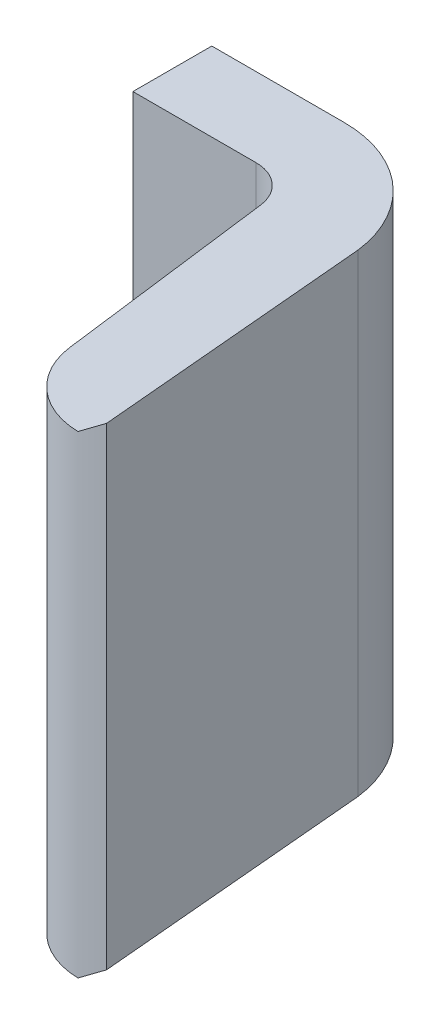
ISO-10303-21;
HEADER;
FILE_DESCRIPTION(('STEP AP214'),'2;1');
FILE_NAME('part.step','',(''),(''),'','','');
FILE_SCHEMA(('AUTOMOTIVE_DESIGN { 1 0 10303 214 1 1 1 1 }'));
ENDSEC;
DATA;
#1=APPLICATION_CONTEXT('core data for automotive mechanical design processes');
#2=APPLICATION_PROTOCOL_DEFINITION('international standard','automotive_design',2000,#1);
#3=PRODUCT_CONTEXT('',#1,'mechanical');
#4=PRODUCT('Part','Part','',(#3));
#5=PRODUCT_RELATED_PRODUCT_CATEGORY('part','',(#4));
#6=PRODUCT_DEFINITION_FORMATION('','',#4);
#7=PRODUCT_DEFINITION_CONTEXT('part definition',#1,'design');
#8=PRODUCT_DEFINITION('design','',#6,#7);
#9=PRODUCT_DEFINITION_SHAPE('','',#8);
#10=(LENGTH_UNIT() NAMED_UNIT(*) SI_UNIT(.MILLI.,.METRE.));
#11=(NAMED_UNIT(*) PLANE_ANGLE_UNIT() SI_UNIT($,.RADIAN.));
#12=(NAMED_UNIT(*) SI_UNIT($,.STERADIAN.) SOLID_ANGLE_UNIT());
#13=UNCERTAINTY_MEASURE_WITH_UNIT(LENGTH_MEASURE(1.E-05),#10,'distance_accuracy_value','');
#14=(GEOMETRIC_REPRESENTATION_CONTEXT(3) GLOBAL_UNCERTAINTY_ASSIGNED_CONTEXT((#13)) GLOBAL_UNIT_ASSIGNED_CONTEXT((#10,
#11,#12)) REPRESENTATION_CONTEXT('',''));
#15=CARTESIAN_POINT('',(0.,0.,0.));
#16=DIRECTION('',(0.,0.,1.));
#17=DIRECTION('',(1.,0.,0.));
#18=AXIS2_PLACEMENT_3D('',#15,#16,#17);
#19=CARTESIAN_POINT('',(-1.65,-0.3,0.0999999999999998));
#20=DIRECTION('',(-1.,0.,0.));
#21=DIRECTION('',(0.,0.,1.));
#22=AXIS2_PLACEMENT_3D('',#19,#20,#21);
#23=PLANE('',#22);
#24=DIRECTION('',(0.,0.,1.));
#25=VECTOR('',#24,1.);
#26=CARTESIAN_POINT('',(-1.65,-0.3,0.15));
#27=LINE('',#26,#25);
#28=CARTESIAN_POINT('',(-1.65,-0.3,0.));
#29=VERTEX_POINT('',#28);
#30=CARTESIAN_POINT('',(-1.65,-0.3,0.0999999999999998));
#31=VERTEX_POINT('',#30);
#32=EDGE_CURVE('E87',#29,#31,#27,.T.);
#33=ORIENTED_EDGE('',*,*,#32,.T.);
#34=DIRECTION('',(0.,1.,0.));
#35=VECTOR('',#34,1.);
#36=CARTESIAN_POINT('',(-1.65,-0.3,0.0999999999999998));
#37=LINE('',#36,#35);
#38=CARTESIAN_POINT('',(-1.65,0.3,0.0999999999999998));
#39=VERTEX_POINT('',#38);
#40=EDGE_CURVE('E78',#39,#31,#37,.F.);
#41=ORIENTED_EDGE('',*,*,#40,.F.);
#42=DIRECTION('',(0.,0.,1.));
#43=VECTOR('',#42,1.);
#44=CARTESIAN_POINT('',(-1.65,0.3,0.15));
#45=LINE('',#44,#43);
#46=CARTESIAN_POINT('',(-1.65,0.3,0.));
#47=VERTEX_POINT('',#46);
#48=EDGE_CURVE('E89',#47,#39,#45,.T.);
#49=ORIENTED_EDGE('',*,*,#48,.F.);
#50=DIRECTION('',(0.,1.,0.));
#51=VECTOR('',#50,1.);
#52=CARTESIAN_POINT('',(-1.65,-0.3,0.));
#53=LINE('',#52,#51);
#54=EDGE_CURVE('E84',#29,#47,#53,.T.);
#55=ORIENTED_EDGE('',*,*,#54,.F.);
#56=EDGE_LOOP('',(#33,#41,#49,#55));
#57=FACE_BOUND('',#56,.T.);
#58=ADVANCED_FACE('F16',(#57),#23,.T.);
#59=CARTESIAN_POINT('',(-1.6,-0.3,0.0999999999999998));
#60=DIRECTION('',(0.,0.,1.));
#61=DIRECTION('',(1.,0.,0.));
#62=AXIS2_PLACEMENT_3D('',#59,#60,#61);
#63=PLANE('',#62);
#64=DIRECTION('',(1.,0.,0.));
#65=VECTOR('',#64,1.);
#66=CARTESIAN_POINT('',(-1.48213745767196,-0.3,0.0999999999999998));
#67=LINE('',#66,#65);
#68=CARTESIAN_POINT('',(-1.49402710895191,-0.3,0.0999999999999999));
#69=VERTEX_POINT('',#68);
#70=EDGE_CURVE('E105',#31,#69,#67,.T.);
#71=ORIENTED_EDGE('',*,*,#70,.T.);
#72=DIRECTION('',(0.,-1.,0.));
#73=VECTOR('',#72,1.);
#74=CARTESIAN_POINT('',(-1.49402710895191,-0.3,0.1));
#75=LINE('',#74,#73);
#76=CARTESIAN_POINT('',(-1.49402710895191,0.3,0.0999999999999999));
#77=VERTEX_POINT('',#76);
#78=EDGE_CURVE('E68',#69,#77,#75,.F.);
#79=ORIENTED_EDGE('',*,*,#78,.T.);
#80=DIRECTION('',(1.,0.,0.));
#81=VECTOR('',#80,1.);
#82=CARTESIAN_POINT('',(-1.48213745767196,0.3,0.0999999999999998));
#83=LINE('',#82,#81);
#84=EDGE_CURVE('E131',#39,#77,#83,.T.);
#85=ORIENTED_EDGE('',*,*,#84,.F.);
#86=ORIENTED_EDGE('',*,*,#40,.T.);
#87=EDGE_LOOP('',(#71,#79,#85,#86));
#88=FACE_BOUND('',#87,.T.);
#89=ADVANCED_FACE('F194',(#88),#63,.T.);
#90=CARTESIAN_POINT('',(-1.49402710895191,-0.3,0.15));
#91=DIRECTION('',(0.,-1.,0.));
#92=DIRECTION('',(0.,0.,-1.));
#93=AXIS2_PLACEMENT_3D('',#90,#91,#92);
#94=CYLINDRICAL_SURFACE('',#93,0.05);
#95=ORIENTED_EDGE('',*,*,#78,.F.);
#96=CARTESIAN_POINT('',(-1.49402710895191,-0.3,0.15));
#97=DIRECTION('',(0.,-1.,0.));
#98=DIRECTION('',(0.,0.,-1.));
#99=AXIS2_PLACEMENT_3D('',#96,#97,#98);
#100=CIRCLE('',#99,0.05);
#101=CARTESIAN_POINT('',(-1.44442900532684,-0.3,0.143673222242183));
#102=VERTEX_POINT('',#101);
#103=EDGE_CURVE('E108',#69,#102,#100,.T.);
#104=ORIENTED_EDGE('',*,*,#103,.T.);
#105=DIRECTION('',(0.,1.,0.));
#106=VECTOR('',#105,1.);
#107=CARTESIAN_POINT('',(-1.44442900532684,-0.3,0.143673222242183));
#108=LINE('',#107,#106);
#109=CARTESIAN_POINT('',(-1.44442900532684,0.3,0.143673222242183));
#110=VERTEX_POINT('',#109);
#111=EDGE_CURVE('E123',#110,#102,#108,.F.);
#112=ORIENTED_EDGE('',*,*,#111,.F.);
#113=CARTESIAN_POINT('',(-1.49402710895191,0.3,0.15));
#114=DIRECTION('',(0.,-1.,0.));
#115=DIRECTION('',(0.,0.,-1.));
#116=AXIS2_PLACEMENT_3D('',#113,#114,#115);
#117=CIRCLE('',#116,0.05);
#118=EDGE_CURVE('E19',#77,#110,#117,.T.);
#119=ORIENTED_EDGE('',*,*,#118,.F.);
#120=EDGE_LOOP('',(#95,#104,#112,#119));
#121=FACE_BOUND('',#120,.T.);
#122=ADVANCED_FACE('F196',(#121),#94,.F.);
#123=CARTESIAN_POINT('',(-1.40909283035833,-0.3,0.420687420446988));
#124=DIRECTION('',(-0.991962072501402,0.,0.126535555156341));
#125=DIRECTION('',(0.126535555156341,0.,0.991962072501402));
#126=AXIS2_PLACEMENT_3D('',#123,#124,#125);
#127=PLANE('',#126);
#128=DIRECTION('',(0.126535555156347,0.,0.991962072501401));
#129=VECTOR('',#128,1.);
#130=CARTESIAN_POINT('',(-1.44442900532684,-0.3,0.143673222242183));
#131=LINE('',#130,#129);
#132=CARTESIAN_POINT('',(-1.40909283035833,-0.3,0.420687420446988));
#133=VERTEX_POINT('',#132);
#134=EDGE_CURVE('E145',#102,#133,#131,.T.);
#135=ORIENTED_EDGE('',*,*,#134,.T.);
#136=DIRECTION('',(0.,-1.,0.));
#137=VECTOR('',#136,1.);
#138=CARTESIAN_POINT('',(-1.40909283035833,-0.3,0.420687420446988));
#139=LINE('',#138,#137);
#140=CARTESIAN_POINT('',(-1.40909283035833,0.3,0.420687420446988));
#141=VERTEX_POINT('',#140);
#142=EDGE_CURVE('E118',#141,#133,#139,.T.);
#143=ORIENTED_EDGE('',*,*,#142,.F.);
#144=DIRECTION('',(0.126535555156347,0.,0.991962072501401));
#145=VECTOR('',#144,1.);
#146=CARTESIAN_POINT('',(-1.44442900532684,0.3,0.143673222242183));
#147=LINE('',#146,#145);
#148=EDGE_CURVE('E150',#110,#141,#147,.T.);
#149=ORIENTED_EDGE('',*,*,#148,.F.);
#150=ORIENTED_EDGE('',*,*,#111,.T.);
#151=EDGE_LOOP('',(#135,#143,#149,#150));
#152=FACE_BOUND('',#151,.T.);
#153=ADVANCED_FACE('F188',(#152),#127,.T.);
#154=CARTESIAN_POINT('',(-1.30989662310819,-0.3,0.408033864931354));
#155=DIRECTION('',(0.,-1.,0.));
#156=DIRECTION('',(0.,0.,-1.));
#157=AXIS2_PLACEMENT_3D('',#154,#155,#156);
#158=CYLINDRICAL_SURFACE('',#157,0.1);
#159=CARTESIAN_POINT('',(-1.30989662310819,-0.3,0.408033864931354));
#160=DIRECTION('',(0.,-1.,0.));
#161=DIRECTION('',(0.,0.,-1.));
#162=AXIS2_PLACEMENT_3D('',#159,#160,#161);
#163=CIRCLE('',#162,0.1);
#164=CARTESIAN_POINT('',(-1.30241584311224,-0.3,0.4810644546597));
#165=VERTEX_POINT('',#164);
#166=EDGE_CURVE('E100',#133,#165,#163,.F.);
#167=ORIENTED_EDGE('',*,*,#166,.T.);
#168=DIRECTION('',(0.,1.,0.));
#169=VECTOR('',#168,1.);
#170=CARTESIAN_POINT('',(-1.32208355744871,-0.3,0.507288480095486));
#171=LINE('',#170,#169);
#172=CARTESIAN_POINT('',(-1.30241584311224,0.3,0.4810644546597));
#173=VERTEX_POINT('',#172);
#174=EDGE_CURVE('E92',#173,#165,#171,.F.);
#175=ORIENTED_EDGE('',*,*,#174,.F.);
#176=CARTESIAN_POINT('',(-1.30989662310819,0.3,0.408033864931354));
#177=DIRECTION('',(0.,-1.,0.));
#178=DIRECTION('',(0.,0.,-1.));
#179=AXIS2_PLACEMENT_3D('',#176,#177,#178);
#180=CIRCLE('',#179,0.1);
#181=EDGE_CURVE('E110',#141,#173,#180,.F.);
#182=ORIENTED_EDGE('',*,*,#181,.F.);
#183=ORIENTED_EDGE('',*,*,#142,.T.);
#184=EDGE_LOOP('',(#167,#175,#182,#183));
#185=FACE_BOUND('',#184,.T.);
#186=ADVANCED_FACE('F190',(#185),#158,.T.);
#187=CARTESIAN_POINT('',(-1.3,-0.3,0.51));
#188=DIRECTION('',(-0.12186934340515,0.,0.992546151641322));
#189=DIRECTION('',(0.992546151641322,0.,0.12186934340515));
#190=AXIS2_PLACEMENT_3D('',#187,#188,#189);
#191=PLANE('',#190);
#192=ORIENTED_EDGE('',*,*,#174,.T.);
#193=DIRECTION('',(0.,-1.,0.));
#194=VECTOR('',#193,1.);
#195=CARTESIAN_POINT('',(-1.28492710388734,-0.3,0.511850718930728));
#196=LINE('',#195,#194);
#197=EDGE_CURVE('E134',#173,#165,#196,.T.);
#198=ORIENTED_EDGE('',*,*,#197,.F.);
#199=EDGE_LOOP('',(#192,#198));
#200=FACE_BOUND('',#199,.T.);
#201=ADVANCED_FACE('F192',(#200),#191,.T.);
#202=CARTESIAN_POINT('',(-1.6,-0.3,0.));
#203=DIRECTION('',(0.,0.,-1.));
#204=DIRECTION('',(-1.,0.,0.));
#205=AXIS2_PLACEMENT_3D('',#202,#203,#204);
#206=PLANE('',#205);
#207=DIRECTION('',(1.,0.,0.));
#208=VECTOR('',#207,1.);
#209=CARTESIAN_POINT('',(-1.48213745767196,-0.3,0.));
#210=LINE('',#209,#208);
#211=CARTESIAN_POINT('',(-1.48213745767196,-0.3,0.));
#212=VERTEX_POINT('',#211);
#213=EDGE_CURVE('E95',#212,#29,#210,.F.);
#214=ORIENTED_EDGE('',*,*,#213,.T.);
#215=ORIENTED_EDGE('',*,*,#54,.T.);
#216=DIRECTION('',(1.,0.,0.));
#217=VECTOR('',#216,1.);
#218=CARTESIAN_POINT('',(-1.48213745767196,0.3,0.));
#219=LINE('',#218,#217);
#220=CARTESIAN_POINT('',(-1.48213745767196,0.3,0.));
#221=VERTEX_POINT('',#220);
#222=EDGE_CURVE('E106',#221,#47,#219,.F.);
#223=ORIENTED_EDGE('',*,*,#222,.F.);
#224=DIRECTION('',(0.,-1.,0.));
#225=VECTOR('',#224,1.);
#226=CARTESIAN_POINT('',(-1.48213745767196,-0.3,0.));
#227=LINE('',#226,#225);
#228=EDGE_CURVE('E98',#212,#221,#227,.F.);
#229=ORIENTED_EDGE('',*,*,#228,.F.);
#230=EDGE_LOOP('',(#214,#215,#223,#229));
#231=FACE_BOUND('',#230,.T.);
#232=ADVANCED_FACE('F96',(#231),#206,.T.);
#233=CARTESIAN_POINT('',(-1.48213745767196,0.3,0.15));
#234=DIRECTION('',(0.,1.,0.));
#235=DIRECTION('',(0.,0.,1.));
#236=AXIS2_PLACEMENT_3D('',#233,#234,#235);
#237=PLANE('',#236);
#238=CARTESIAN_POINT('',(-1.48213745767196,0.3,0.15));
#239=DIRECTION('',(0.,-1.,0.));
#240=DIRECTION('',(0.,0.,-1.));
#241=AXIS2_PLACEMENT_3D('',#238,#239,#240);
#242=CIRCLE('',#241,0.15);
#243=CARTESIAN_POINT('',(-1.33333516022967,0.3,0.131082381865135));
#244=VERTEX_POINT('',#243);
#245=EDGE_CURVE('E99',#221,#244,#242,.T.);
#246=ORIENTED_EDGE('',*,*,#245,.F.);
#247=ORIENTED_EDGE('',*,*,#222,.T.);
#248=ORIENTED_EDGE('',*,*,#48,.T.);
#249=ORIENTED_EDGE('',*,*,#84,.T.);
#250=ORIENTED_EDGE('',*,*,#118,.T.);
#251=ORIENTED_EDGE('',*,*,#148,.T.);
#252=ORIENTED_EDGE('',*,*,#181,.T.);
#253=DIRECTION('',(-0.126117454232434,0.,-0.992015316281926));
#254=VECTOR('',#253,1.);
#255=CARTESIAN_POINT('',(-1.33333516022967,0.3,0.131082381865135));
#256=LINE('',#255,#254);
#257=EDGE_CURVE('E137',#244,#173,#256,.F.);
#258=ORIENTED_EDGE('',*,*,#257,.F.);
#259=EDGE_LOOP('',(#246,#247,#248,#249,#250,#251,#252,#258));
#260=FACE_BOUND('',#259,.T.);
#261=ADVANCED_FACE('F193',(#260),#237,.T.);
#262=CARTESIAN_POINT('',(-1.48213745767196,-0.3,0.15));
#263=DIRECTION('',(0.,1.,0.));
#264=DIRECTION('',(0.,0.,1.));
#265=AXIS2_PLACEMENT_3D('',#262,#263,#264);
#266=PLANE('',#265);
#267=CARTESIAN_POINT('',(-1.48213745767196,-0.3,0.15));
#268=DIRECTION('',(0.,-1.,0.));
#269=DIRECTION('',(0.,0.,-1.));
#270=AXIS2_PLACEMENT_3D('',#267,#268,#269);
#271=CIRCLE('',#270,0.15);
#272=CARTESIAN_POINT('',(-1.33333516022967,-0.3,0.131082381865135));
#273=VERTEX_POINT('',#272);
#274=EDGE_CURVE('E34',#273,#212,#271,.F.);
#275=ORIENTED_EDGE('',*,*,#274,.F.);
#276=DIRECTION('',(-0.126117454232434,0.,-0.992015316281926));
#277=VECTOR('',#276,1.);
#278=CARTESIAN_POINT('',(-1.33333516022967,-0.3,0.131082381865135));
#279=LINE('',#278,#277);
#280=EDGE_CURVE('E25',#165,#273,#279,.T.);
#281=ORIENTED_EDGE('',*,*,#280,.F.);
#282=ORIENTED_EDGE('',*,*,#166,.F.);
#283=ORIENTED_EDGE('',*,*,#134,.F.);
#284=ORIENTED_EDGE('',*,*,#103,.F.);
#285=ORIENTED_EDGE('',*,*,#70,.F.);
#286=ORIENTED_EDGE('',*,*,#32,.F.);
#287=ORIENTED_EDGE('',*,*,#213,.F.);
#288=EDGE_LOOP('',(#275,#281,#282,#283,#284,#285,#286,#287));
#289=FACE_BOUND('',#288,.T.);
#290=ADVANCED_FACE('F103',(#289),#266,.F.);
#291=CARTESIAN_POINT('',(-1.48213745767196,-0.3,0.15));
#292=DIRECTION('',(0.,-1.,0.));
#293=DIRECTION('',(0.,0.,-1.));
#294=AXIS2_PLACEMENT_3D('',#291,#292,#293);
#295=CYLINDRICAL_SURFACE('',#294,0.15);
#296=ORIENTED_EDGE('',*,*,#274,.T.);
#297=ORIENTED_EDGE('',*,*,#228,.T.);
#298=ORIENTED_EDGE('',*,*,#245,.T.);
#299=DIRECTION('',(0.,1.,0.));
#300=VECTOR('',#299,1.);
#301=CARTESIAN_POINT('',(-1.33333516022967,-0.3,0.131082381865135));
#302=LINE('',#301,#300);
#303=EDGE_CURVE('E10',#273,#244,#302,.T.);
#304=ORIENTED_EDGE('',*,*,#303,.F.);
#305=EDGE_LOOP('',(#296,#297,#298,#304));
#306=FACE_BOUND('',#305,.T.);
#307=ADVANCED_FACE('F171',(#306),#295,.T.);
#308=CARTESIAN_POINT('',(-1.33333516022967,-0.3,0.131082381865135));
#309=DIRECTION('',(0.992015316281926,0.,-0.126117454232434));
#310=DIRECTION('',(-0.126117454232434,0.,-0.992015316281926));
#311=AXIS2_PLACEMENT_3D('',#308,#309,#310);
#312=PLANE('',#311);
#313=ORIENTED_EDGE('',*,*,#280,.T.);
#314=ORIENTED_EDGE('',*,*,#303,.T.);
#315=ORIENTED_EDGE('',*,*,#257,.T.);
#316=ORIENTED_EDGE('',*,*,#197,.T.);
#317=EDGE_LOOP('',(#313,#314,#315,#316));
#318=FACE_BOUND('',#317,.T.);
#319=ADVANCED_FACE('F175',(#318),#312,.T.);
#320=CLOSED_SHELL('',(#58,#89,#122,#153,#186,#201,#232,#261,#290,#307,#319));
#321=MANIFOLD_SOLID_BREP('B1',#320);
#322=ADVANCED_BREP_SHAPE_REPRESENTATION('',(#18,#321),#14);
#323=SHAPE_DEFINITION_REPRESENTATION(#9,#322);
ENDSEC;
END-ISO-10303-21;
